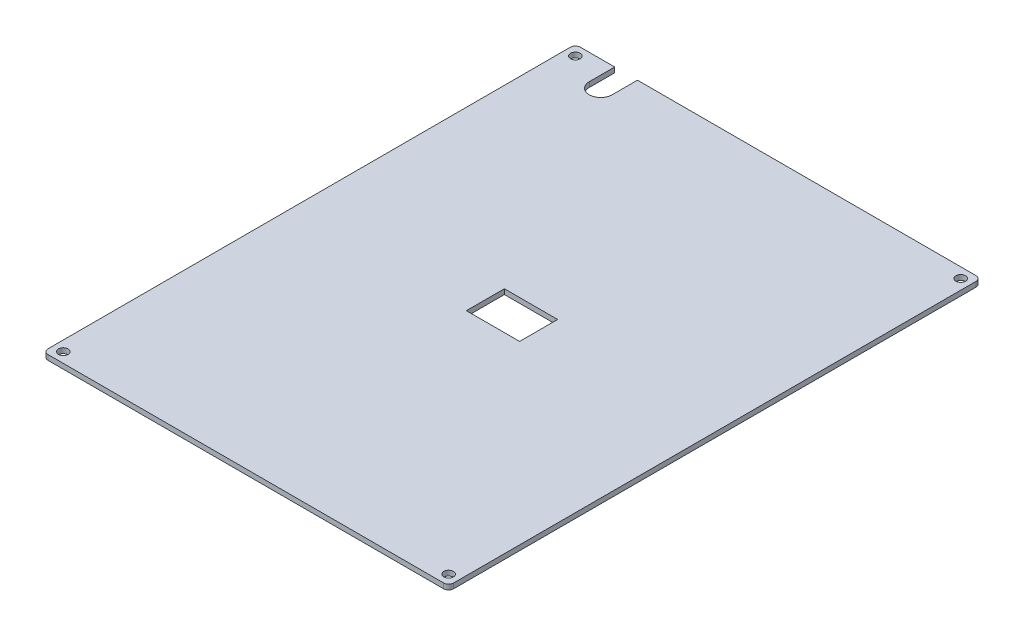
ISO-10303-21;
HEADER;
FILE_DESCRIPTION(('STEP AP214'),'2;1');
FILE_NAME('part.step','',(''),(''),'','','');
FILE_SCHEMA(('AUTOMOTIVE_DESIGN { 1 0 10303 214 1 1 1 1 }'));
ENDSEC;
DATA;
#1=APPLICATION_CONTEXT('core data for automotive mechanical design processes');
#2=APPLICATION_PROTOCOL_DEFINITION('international standard','automotive_design',2000,#1);
#3=PRODUCT_CONTEXT('',#1,'mechanical');
#4=PRODUCT('Part','Part','',(#3));
#5=PRODUCT_RELATED_PRODUCT_CATEGORY('part','',(#4));
#6=PRODUCT_DEFINITION_FORMATION('','',#4);
#7=PRODUCT_DEFINITION_CONTEXT('part definition',#1,'design');
#8=PRODUCT_DEFINITION('design','',#6,#7);
#9=PRODUCT_DEFINITION_SHAPE('','',#8);
#10=(LENGTH_UNIT() NAMED_UNIT(*) SI_UNIT(.MILLI.,.METRE.));
#11=(NAMED_UNIT(*) PLANE_ANGLE_UNIT() SI_UNIT($,.RADIAN.));
#12=(NAMED_UNIT(*) SI_UNIT($,.STERADIAN.) SOLID_ANGLE_UNIT());
#13=UNCERTAINTY_MEASURE_WITH_UNIT(LENGTH_MEASURE(1.E-05),#10,'distance_accuracy_value','');
#14=(GEOMETRIC_REPRESENTATION_CONTEXT(3) GLOBAL_UNCERTAINTY_ASSIGNED_CONTEXT((#13)) GLOBAL_UNIT_ASSIGNED_CONTEXT((#10,
#11,#12)) REPRESENTATION_CONTEXT('',''));
#15=CARTESIAN_POINT('',(0.,0.,0.));
#16=DIRECTION('',(0.,0.,1.));
#17=DIRECTION('',(1.,0.,0.));
#18=AXIS2_PLACEMENT_3D('',#15,#16,#17);
#19=CARTESIAN_POINT('',(0.,2.,-210.));
#20=DIRECTION('',(0.,0.,1.));
#21=DIRECTION('',(1.,0.,0.));
#22=AXIS2_PLACEMENT_3D('',#19,#20,#21);
#23=PLANE('',#22);
#24=DIRECTION('',(-1.,0.,0.));
#25=VECTOR('',#24,1.);
#26=CARTESIAN_POINT('',(0.,0.,-210.));
#27=LINE('',#26,#25);
#28=CARTESIAN_POINT('',(15.5,0.,-210.));
#29=VERTEX_POINT('',#28);
#30=CARTESIAN_POINT('',(2.,0.,-210.));
#31=VERTEX_POINT('',#30);
#32=EDGE_CURVE('E228',#29,#31,#27,.T.);
#33=ORIENTED_EDGE('',*,*,#32,.T.);
#34=DIRECTION('',(0.,-1.,0.));
#35=VECTOR('',#34,1.);
#36=CARTESIAN_POINT('',(2.,2.,-210.));
#37=LINE('',#36,#35);
#38=CARTESIAN_POINT('',(2.,2.,-210.));
#39=VERTEX_POINT('',#38);
#40=EDGE_CURVE('E279',#31,#39,#37,.F.);
#41=ORIENTED_EDGE('',*,*,#40,.T.);
#42=DIRECTION('',(-1.,0.,0.));
#43=VECTOR('',#42,1.);
#44=CARTESIAN_POINT('',(0.,2.,-210.));
#45=LINE('',#44,#43);
#46=CARTESIAN_POINT('',(15.5,2.,-210.));
#47=VERTEX_POINT('',#46);
#48=EDGE_CURVE('E214',#47,#39,#45,.T.);
#49=ORIENTED_EDGE('',*,*,#48,.F.);
#50=DIRECTION('',(0.,1.,0.));
#51=VECTOR('',#50,1.);
#52=CARTESIAN_POINT('',(15.5,-8.,-210.));
#53=LINE('',#52,#51);
#54=EDGE_CURVE('E195',#29,#47,#53,.T.);
#55=ORIENTED_EDGE('',*,*,#54,.F.);
#56=EDGE_LOOP('',(#33,#41,#49,#55));
#57=FACE_BOUND('',#56,.T.);
#58=ADVANCED_FACE('F33',(#57),#23,.F.);
#59=CARTESIAN_POINT('',(0.,2.,0.));
#60=DIRECTION('',(1.,0.,0.));
#61=DIRECTION('',(0.,0.,-1.));
#62=AXIS2_PLACEMENT_3D('',#59,#60,#61);
#63=PLANE('',#62);
#64=DIRECTION('',(0.,0.,1.));
#65=VECTOR('',#64,1.);
#66=CARTESIAN_POINT('',(0.,0.,0.));
#67=LINE('',#66,#65);
#68=CARTESIAN_POINT('',(0.,0.,-208.));
#69=VERTEX_POINT('',#68);
#70=CARTESIAN_POINT('',(0.,0.,-2.));
#71=VERTEX_POINT('',#70);
#72=EDGE_CURVE('E218',#69,#71,#67,.T.);
#73=ORIENTED_EDGE('',*,*,#72,.T.);
#74=DIRECTION('',(0.,-1.,0.));
#75=VECTOR('',#74,1.);
#76=CARTESIAN_POINT('',(0.,2.,-2.));
#77=LINE('',#76,#75);
#78=CARTESIAN_POINT('',(0.,2.,-2.));
#79=VERTEX_POINT('',#78);
#80=EDGE_CURVE('E261',#71,#79,#77,.F.);
#81=ORIENTED_EDGE('',*,*,#80,.T.);
#82=DIRECTION('',(0.,0.,1.));
#83=VECTOR('',#82,1.);
#84=CARTESIAN_POINT('',(0.,2.,0.));
#85=LINE('',#84,#83);
#86=CARTESIAN_POINT('',(0.,2.,-208.));
#87=VERTEX_POINT('',#86);
#88=EDGE_CURVE('E204',#87,#79,#85,.T.);
#89=ORIENTED_EDGE('',*,*,#88,.F.);
#90=DIRECTION('',(0.,-1.,0.));
#91=VECTOR('',#90,1.);
#92=CARTESIAN_POINT('',(0.,2.,-208.));
#93=LINE('',#92,#91);
#94=EDGE_CURVE('E258',#87,#69,#93,.T.);
#95=ORIENTED_EDGE('',*,*,#94,.T.);
#96=EDGE_LOOP('',(#73,#81,#89,#95));
#97=FACE_BOUND('',#96,.T.);
#98=ADVANCED_FACE('F304',(#97),#63,.F.);
#99=CARTESIAN_POINT('',(0.,2.,0.));
#100=DIRECTION('',(0.,0.,-1.));
#101=DIRECTION('',(-1.,0.,0.));
#102=AXIS2_PLACEMENT_3D('',#99,#100,#101);
#103=PLANE('',#102);
#104=DIRECTION('',(1.,0.,0.));
#105=VECTOR('',#104,1.);
#106=CARTESIAN_POINT('',(0.,2.,0.));
#107=LINE('',#106,#105);
#108=CARTESIAN_POINT('',(2.,2.,0.));
#109=VERTEX_POINT('',#108);
#110=CARTESIAN_POINT('',(158.,2.,0.));
#111=VERTEX_POINT('',#110);
#112=EDGE_CURVE('E207',#109,#111,#107,.T.);
#113=ORIENTED_EDGE('',*,*,#112,.F.);
#114=DIRECTION('',(0.,-1.,0.));
#115=VECTOR('',#114,1.);
#116=CARTESIAN_POINT('',(2.,2.,0.));
#117=LINE('',#116,#115);
#118=CARTESIAN_POINT('',(2.,0.,0.));
#119=VERTEX_POINT('',#118);
#120=EDGE_CURVE('E247',#109,#119,#117,.T.);
#121=ORIENTED_EDGE('',*,*,#120,.T.);
#122=DIRECTION('',(1.,0.,0.));
#123=VECTOR('',#122,1.);
#124=CARTESIAN_POINT('',(0.,0.,0.));
#125=LINE('',#124,#123);
#126=CARTESIAN_POINT('',(158.,0.,0.));
#127=VERTEX_POINT('',#126);
#128=EDGE_CURVE('E221',#119,#127,#125,.T.);
#129=ORIENTED_EDGE('',*,*,#128,.T.);
#130=DIRECTION('',(0.,-1.,0.));
#131=VECTOR('',#130,1.);
#132=CARTESIAN_POINT('',(158.,2.,0.));
#133=LINE('',#132,#131);
#134=EDGE_CURVE('E245',#127,#111,#133,.F.);
#135=ORIENTED_EDGE('',*,*,#134,.T.);
#136=EDGE_LOOP('',(#113,#121,#129,#135));
#137=FACE_BOUND('',#136,.T.);
#138=ADVANCED_FACE('F311',(#137),#103,.F.);
#139=CARTESIAN_POINT('',(160.,2.,0.));
#140=DIRECTION('',(-1.,0.,0.));
#141=DIRECTION('',(0.,0.,1.));
#142=AXIS2_PLACEMENT_3D('',#139,#140,#141);
#143=PLANE('',#142);
#144=DIRECTION('',(0.,0.,-1.));
#145=VECTOR('',#144,1.);
#146=CARTESIAN_POINT('',(160.,2.,0.));
#147=LINE('',#146,#145);
#148=CARTESIAN_POINT('',(160.,2.,-2.));
#149=VERTEX_POINT('',#148);
#150=CARTESIAN_POINT('',(160.,2.,-208.));
#151=VERTEX_POINT('',#150);
#152=EDGE_CURVE('E211',#149,#151,#147,.T.);
#153=ORIENTED_EDGE('',*,*,#152,.F.);
#154=DIRECTION('',(0.,-1.,0.));
#155=VECTOR('',#154,1.);
#156=CARTESIAN_POINT('',(160.,2.,-2.));
#157=LINE('',#156,#155);
#158=CARTESIAN_POINT('',(160.,0.,-2.));
#159=VERTEX_POINT('',#158);
#160=EDGE_CURVE('E273',#149,#159,#157,.T.);
#161=ORIENTED_EDGE('',*,*,#160,.T.);
#162=DIRECTION('',(0.,0.,-1.));
#163=VECTOR('',#162,1.);
#164=CARTESIAN_POINT('',(160.,0.,0.));
#165=LINE('',#164,#163);
#166=CARTESIAN_POINT('',(160.,0.,-208.));
#167=VERTEX_POINT('',#166);
#168=EDGE_CURVE('E225',#159,#167,#165,.T.);
#169=ORIENTED_EDGE('',*,*,#168,.T.);
#170=DIRECTION('',(0.,-1.,0.));
#171=VECTOR('',#170,1.);
#172=CARTESIAN_POINT('',(160.,2.,-208.));
#173=LINE('',#172,#171);
#174=EDGE_CURVE('E271',#167,#151,#173,.F.);
#175=ORIENTED_EDGE('',*,*,#174,.T.);
#176=EDGE_LOOP('',(#153,#161,#169,#175));
#177=FACE_BOUND('',#176,.T.);
#178=ADVANCED_FACE('F318',(#177),#143,.F.);
#179=CARTESIAN_POINT('',(158.,2.,-210.));
#180=VERTEX_POINT('',#179);
#181=CARTESIAN_POINT('',(24.5,2.,-210.));
#182=VERTEX_POINT('',#181);
#183=EDGE_CURVE('E215',#180,#182,#45,.T.);
#184=ORIENTED_EDGE('',*,*,#183,.F.);
#185=DIRECTION('',(0.,-1.,0.));
#186=VECTOR('',#185,1.);
#187=CARTESIAN_POINT('',(158.,2.,-210.));
#188=LINE('',#187,#186);
#189=CARTESIAN_POINT('',(158.,0.,-210.));
#190=VERTEX_POINT('',#189);
#191=EDGE_CURVE('E276',#180,#190,#188,.T.);
#192=ORIENTED_EDGE('',*,*,#191,.T.);
#193=CARTESIAN_POINT('',(24.5,0.,-210.));
#194=VERTEX_POINT('',#193);
#195=EDGE_CURVE('E208',#190,#194,#27,.T.);
#196=ORIENTED_EDGE('',*,*,#195,.T.);
#197=DIRECTION('',(0.,1.,0.));
#198=VECTOR('',#197,1.);
#199=CARTESIAN_POINT('',(24.5,-8.,-210.));
#200=LINE('',#199,#198);
#201=EDGE_CURVE('E197',#194,#182,#200,.T.);
#202=ORIENTED_EDGE('',*,*,#201,.T.);
#203=EDGE_LOOP('',(#184,#192,#196,#202));
#204=FACE_BOUND('',#203,.T.);
#205=ADVANCED_FACE('F307',(#204),#23,.F.);
#206=CARTESIAN_POINT('',(0.,2.,0.));
#207=DIRECTION('',(0.,-1.,0.));
#208=DIRECTION('',(0.,0.,-1.));
#209=AXIS2_PLACEMENT_3D('',#206,#207,#208);
#210=PLANE('',#209);
#211=DIRECTION('',(-1.,0.,0.));
#212=VECTOR('',#211,1.);
#213=CARTESIAN_POINT('',(69.5,2.,-112.5));
#214=LINE('',#213,#212);
#215=CARTESIAN_POINT('',(90.5,2.,-112.5));
#216=VERTEX_POINT('',#215);
#217=CARTESIAN_POINT('',(69.5,2.,-112.5));
#218=VERTEX_POINT('',#217);
#219=EDGE_CURVE('E157',#216,#218,#214,.T.);
#220=ORIENTED_EDGE('',*,*,#219,.F.);
#221=DIRECTION('',(0.,0.,-1.));
#222=VECTOR('',#221,1.);
#223=CARTESIAN_POINT('',(90.5,2.,-97.5));
#224=LINE('',#223,#222);
#225=CARTESIAN_POINT('',(90.5,2.,-97.5));
#226=VERTEX_POINT('',#225);
#227=EDGE_CURVE('E48',#226,#216,#224,.T.);
#228=ORIENTED_EDGE('',*,*,#227,.F.);
#229=DIRECTION('',(1.,0.,0.));
#230=VECTOR('',#229,1.);
#231=CARTESIAN_POINT('',(69.5,2.,-97.5));
#232=LINE('',#231,#230);
#233=CARTESIAN_POINT('',(69.5,2.,-97.5));
#234=VERTEX_POINT('',#233);
#235=EDGE_CURVE('E164',#234,#226,#232,.T.);
#236=ORIENTED_EDGE('',*,*,#235,.F.);
#237=DIRECTION('',(0.,0.,1.));
#238=VECTOR('',#237,1.);
#239=CARTESIAN_POINT('',(69.5,2.,-97.5));
#240=LINE('',#239,#238);
#241=EDGE_CURVE('E148',#218,#234,#240,.T.);
#242=ORIENTED_EDGE('',*,*,#241,.F.);
#243=EDGE_LOOP('',(#220,#228,#236,#242));
#244=FACE_BOUND('',#243,.T.);
#245=CARTESIAN_POINT('',(4.,2.,-4.00000000000003));
#246=DIRECTION('',(0.,1.,0.));
#247=DIRECTION('',(0.,0.,-1.));
#248=AXIS2_PLACEMENT_3D('',#245,#246,#247);
#249=CIRCLE('',#248,1.9);
#250=CARTESIAN_POINT('',(4.,2.,-5.90000000000003));
#251=VERTEX_POINT('',#250);
#252=EDGE_CURVE('E181',#251,#251,#249,.T.);
#253=ORIENTED_EDGE('',*,*,#252,.F.);
#254=EDGE_LOOP('',(#253));
#255=FACE_BOUND('',#254,.T.);
#256=CARTESIAN_POINT('',(156.,2.,-4.));
#257=DIRECTION('',(0.,1.,0.));
#258=DIRECTION('',(0.,0.,1.));
#259=AXIS2_PLACEMENT_3D('',#256,#257,#258);
#260=CIRCLE('',#259,1.9);
#261=CARTESIAN_POINT('',(156.,2.,-2.1));
#262=VERTEX_POINT('',#261);
#263=EDGE_CURVE('E178',#262,#262,#260,.T.);
#264=ORIENTED_EDGE('',*,*,#263,.F.);
#265=EDGE_LOOP('',(#264));
#266=FACE_BOUND('',#265,.T.);
#267=CARTESIAN_POINT('',(156.,2.,-206.));
#268=DIRECTION('',(0.,1.,0.));
#269=DIRECTION('',(0.,0.,-1.));
#270=AXIS2_PLACEMENT_3D('',#267,#268,#269);
#271=CIRCLE('',#270,1.90000000000001);
#272=CARTESIAN_POINT('',(156.,2.,-207.9));
#273=VERTEX_POINT('',#272);
#274=EDGE_CURVE('E174',#273,#273,#271,.T.);
#275=ORIENTED_EDGE('',*,*,#274,.F.);
#276=EDGE_LOOP('',(#275));
#277=FACE_BOUND('',#276,.T.);
#278=CARTESIAN_POINT('',(4.,2.,-206.));
#279=DIRECTION('',(0.,1.,0.));
#280=DIRECTION('',(0.,0.,1.));
#281=AXIS2_PLACEMENT_3D('',#278,#279,#280);
#282=CIRCLE('',#281,1.90000000000001);
#283=CARTESIAN_POINT('',(4.,2.,-204.1));
#284=VERTEX_POINT('',#283);
#285=EDGE_CURVE('E177',#284,#284,#282,.T.);
#286=ORIENTED_EDGE('',*,*,#285,.F.);
#287=EDGE_LOOP('',(#286));
#288=FACE_BOUND('',#287,.T.);
#289=ORIENTED_EDGE('',*,*,#88,.T.);
#290=CARTESIAN_POINT('',(2.,2.,-2.));
#291=DIRECTION('',(0.,-1.,0.));
#292=DIRECTION('',(0.,0.,-1.));
#293=AXIS2_PLACEMENT_3D('',#290,#291,#292);
#294=CIRCLE('',#293,2.);
#295=EDGE_CURVE('E269',#79,#109,#294,.F.);
#296=ORIENTED_EDGE('',*,*,#295,.T.);
#297=ORIENTED_EDGE('',*,*,#112,.T.);
#298=CARTESIAN_POINT('',(158.,2.,-2.));
#299=DIRECTION('',(0.,-1.,0.));
#300=DIRECTION('',(0.,0.,-1.));
#301=AXIS2_PLACEMENT_3D('',#298,#299,#300);
#302=CIRCLE('',#301,2.);
#303=EDGE_CURVE('E267',#111,#149,#302,.F.);
#304=ORIENTED_EDGE('',*,*,#303,.T.);
#305=ORIENTED_EDGE('',*,*,#152,.T.);
#306=CARTESIAN_POINT('',(158.,2.,-208.));
#307=DIRECTION('',(0.,-1.,0.));
#308=DIRECTION('',(0.,0.,-1.));
#309=AXIS2_PLACEMENT_3D('',#306,#307,#308);
#310=CIRCLE('',#309,2.);
#311=EDGE_CURVE('E265',#151,#180,#310,.F.);
#312=ORIENTED_EDGE('',*,*,#311,.T.);
#313=ORIENTED_EDGE('',*,*,#183,.T.);
#314=DIRECTION('',(0.,0.,-1.));
#315=VECTOR('',#314,1.);
#316=CARTESIAN_POINT('',(24.5,2.,-200.));
#317=LINE('',#316,#315);
#318=CARTESIAN_POINT('',(24.5,2.,-200.));
#319=VERTEX_POINT('',#318);
#320=EDGE_CURVE('E187',#319,#182,#317,.T.);
#321=ORIENTED_EDGE('',*,*,#320,.F.);
#322=CARTESIAN_POINT('',(20.,2.,-200.));
#323=DIRECTION('',(0.,1.,0.));
#324=DIRECTION('',(0.,0.,1.));
#325=AXIS2_PLACEMENT_3D('',#322,#323,#324);
#326=CIRCLE('',#325,4.5);
#327=CARTESIAN_POINT('',(15.5,2.,-200.));
#328=VERTEX_POINT('',#327);
#329=EDGE_CURVE('E171',#328,#319,#326,.T.);
#330=ORIENTED_EDGE('',*,*,#329,.F.);
#331=DIRECTION('',(0.,0.,1.));
#332=VECTOR('',#331,1.);
#333=CARTESIAN_POINT('',(15.5,2.,-200.));
#334=LINE('',#333,#332);
#335=EDGE_CURVE('E190',#47,#328,#334,.T.);
#336=ORIENTED_EDGE('',*,*,#335,.F.);
#337=ORIENTED_EDGE('',*,*,#48,.T.);
#338=CARTESIAN_POINT('',(2.,2.,-208.));
#339=DIRECTION('',(0.,-1.,0.));
#340=DIRECTION('',(0.,0.,-1.));
#341=AXIS2_PLACEMENT_3D('',#338,#339,#340);
#342=CIRCLE('',#341,2.);
#343=EDGE_CURVE('E263',#39,#87,#342,.F.);
#344=ORIENTED_EDGE('',*,*,#343,.T.);
#345=EDGE_LOOP('',(#289,#296,#297,#304,#305,#312,#313,#321,#330,#336,#337,#344));
#346=FACE_BOUND('',#345,.T.);
#347=ADVANCED_FACE('F161',(#244,#255,#266,#277,#288,#346),#210,.F.);
#348=CARTESIAN_POINT('',(0.,0.,0.));
#349=DIRECTION('',(0.,-1.,0.));
#350=DIRECTION('',(0.,0.,-1.));
#351=AXIS2_PLACEMENT_3D('',#348,#349,#350);
#352=PLANE('',#351);
#353=DIRECTION('',(0.,0.,1.));
#354=VECTOR('',#353,1.);
#355=CARTESIAN_POINT('',(90.5,0.,0.));
#356=LINE('',#355,#354);
#357=CARTESIAN_POINT('',(90.5,0.,-112.5));
#358=VERTEX_POINT('',#357);
#359=CARTESIAN_POINT('',(90.5,0.,-97.5));
#360=VERTEX_POINT('',#359);
#361=EDGE_CURVE('E11',#358,#360,#356,.T.);
#362=ORIENTED_EDGE('',*,*,#361,.F.);
#363=DIRECTION('',(1.,0.,0.));
#364=VECTOR('',#363,1.);
#365=CARTESIAN_POINT('',(0.,0.,-112.5));
#366=LINE('',#365,#364);
#367=CARTESIAN_POINT('',(69.5,0.,-112.5));
#368=VERTEX_POINT('',#367);
#369=EDGE_CURVE('E281',#368,#358,#366,.T.);
#370=ORIENTED_EDGE('',*,*,#369,.F.);
#371=DIRECTION('',(0.,0.,-1.));
#372=VECTOR('',#371,1.);
#373=CARTESIAN_POINT('',(69.5,0.,0.));
#374=LINE('',#373,#372);
#375=CARTESIAN_POINT('',(69.5,0.,-97.5));
#376=VERTEX_POINT('',#375);
#377=EDGE_CURVE('E151',#376,#368,#374,.T.);
#378=ORIENTED_EDGE('',*,*,#377,.F.);
#379=DIRECTION('',(-1.,0.,0.));
#380=VECTOR('',#379,1.);
#381=CARTESIAN_POINT('',(0.,0.,-97.5));
#382=LINE('',#381,#380);
#383=EDGE_CURVE('E41',#360,#376,#382,.T.);
#384=ORIENTED_EDGE('',*,*,#383,.F.);
#385=EDGE_LOOP('',(#362,#370,#378,#384));
#386=FACE_BOUND('',#385,.T.);
#387=ORIENTED_EDGE('',*,*,#128,.F.);
#388=CARTESIAN_POINT('',(2.,0.,-2.));
#389=DIRECTION('',(0.,-1.,0.));
#390=DIRECTION('',(0.,0.,-1.));
#391=AXIS2_PLACEMENT_3D('',#388,#389,#390);
#392=CIRCLE('',#391,2.);
#393=EDGE_CURVE('E256',#119,#71,#392,.T.);
#394=ORIENTED_EDGE('',*,*,#393,.T.);
#395=ORIENTED_EDGE('',*,*,#72,.F.);
#396=CARTESIAN_POINT('',(2.,0.,-208.));
#397=DIRECTION('',(0.,-1.,0.));
#398=DIRECTION('',(0.,0.,-1.));
#399=AXIS2_PLACEMENT_3D('',#396,#397,#398);
#400=CIRCLE('',#399,2.);
#401=EDGE_CURVE('E250',#69,#31,#400,.T.);
#402=ORIENTED_EDGE('',*,*,#401,.T.);
#403=ORIENTED_EDGE('',*,*,#32,.F.);
#404=DIRECTION('',(0.,0.,-1.));
#405=VECTOR('',#404,1.);
#406=CARTESIAN_POINT('',(15.5000000000002,0.,0.));
#407=LINE('',#406,#405);
#408=CARTESIAN_POINT('',(15.5,0.,-200.));
#409=VERTEX_POINT('',#408);
#410=EDGE_CURVE('E243',#409,#29,#407,.T.);
#411=ORIENTED_EDGE('',*,*,#410,.F.);
#412=CARTESIAN_POINT('',(20.,0.,-200.));
#413=DIRECTION('',(0.,-1.,0.));
#414=DIRECTION('',(0.,0.,-1.));
#415=AXIS2_PLACEMENT_3D('',#412,#413,#414);
#416=CIRCLE('',#415,4.5);
#417=CARTESIAN_POINT('',(24.5,0.,-200.));
#418=VERTEX_POINT('',#417);
#419=EDGE_CURVE('E241',#418,#409,#416,.T.);
#420=ORIENTED_EDGE('',*,*,#419,.F.);
#421=DIRECTION('',(0.,0.,1.));
#422=VECTOR('',#421,1.);
#423=CARTESIAN_POINT('',(24.5000000000001,0.,0.));
#424=LINE('',#423,#422);
#425=EDGE_CURVE('E217',#194,#418,#424,.T.);
#426=ORIENTED_EDGE('',*,*,#425,.F.);
#427=ORIENTED_EDGE('',*,*,#195,.F.);
#428=CARTESIAN_POINT('',(158.,0.,-208.));
#429=DIRECTION('',(0.,-1.,0.));
#430=DIRECTION('',(0.,0.,-1.));
#431=AXIS2_PLACEMENT_3D('',#428,#429,#430);
#432=CIRCLE('',#431,2.);
#433=EDGE_CURVE('E252',#190,#167,#432,.T.);
#434=ORIENTED_EDGE('',*,*,#433,.T.);
#435=ORIENTED_EDGE('',*,*,#168,.F.);
#436=CARTESIAN_POINT('',(158.,0.,-2.));
#437=DIRECTION('',(0.,-1.,0.));
#438=DIRECTION('',(0.,0.,-1.));
#439=AXIS2_PLACEMENT_3D('',#436,#437,#438);
#440=CIRCLE('',#439,2.);
#441=EDGE_CURVE('E254',#159,#127,#440,.T.);
#442=ORIENTED_EDGE('',*,*,#441,.T.);
#443=EDGE_LOOP('',(#387,#394,#395,#402,#403,#411,#420,#426,#427,#434,#435,#442));
#444=FACE_BOUND('',#443,.T.);
#445=CARTESIAN_POINT('',(4.,0.,-4.00000000000003));
#446=DIRECTION('',(0.,-1.,0.));
#447=DIRECTION('',(0.,0.,-1.));
#448=AXIS2_PLACEMENT_3D('',#445,#446,#447);
#449=CIRCLE('',#448,1.9);
#450=CARTESIAN_POINT('',(4.,0.,-5.90000000000003));
#451=VERTEX_POINT('',#450);
#452=EDGE_CURVE('E222',#451,#451,#449,.T.);
#453=ORIENTED_EDGE('',*,*,#452,.F.);
#454=EDGE_LOOP('',(#453));
#455=FACE_BOUND('',#454,.T.);
#456=CARTESIAN_POINT('',(156.,0.,-4.));
#457=DIRECTION('',(0.,-1.,0.));
#458=DIRECTION('',(0.,0.,-1.));
#459=AXIS2_PLACEMENT_3D('',#456,#457,#458);
#460=CIRCLE('',#459,1.9);
#461=CARTESIAN_POINT('',(156.,0.,-5.90000000000001));
#462=VERTEX_POINT('',#461);
#463=EDGE_CURVE('E235',#462,#462,#460,.T.);
#464=ORIENTED_EDGE('',*,*,#463,.F.);
#465=EDGE_LOOP('',(#464));
#466=FACE_BOUND('',#465,.T.);
#467=CARTESIAN_POINT('',(156.,0.,-206.));
#468=DIRECTION('',(0.,-1.,0.));
#469=DIRECTION('',(0.,0.,-1.));
#470=AXIS2_PLACEMENT_3D('',#467,#468,#469);
#471=CIRCLE('',#470,1.90000000000001);
#472=CARTESIAN_POINT('',(156.,0.,-207.9));
#473=VERTEX_POINT('',#472);
#474=EDGE_CURVE('E232',#473,#473,#471,.T.);
#475=ORIENTED_EDGE('',*,*,#474,.F.);
#476=EDGE_LOOP('',(#475));
#477=FACE_BOUND('',#476,.T.);
#478=CARTESIAN_POINT('',(4.,0.,-206.));
#479=DIRECTION('',(0.,-1.,0.));
#480=DIRECTION('',(0.,0.,-1.));
#481=AXIS2_PLACEMENT_3D('',#478,#479,#480);
#482=CIRCLE('',#481,1.90000000000001);
#483=CARTESIAN_POINT('',(4.,0.,-207.9));
#484=VERTEX_POINT('',#483);
#485=EDGE_CURVE('E203',#484,#484,#482,.T.);
#486=ORIENTED_EDGE('',*,*,#485,.F.);
#487=EDGE_LOOP('',(#486));
#488=FACE_BOUND('',#487,.T.);
#489=ADVANCED_FACE('F289',(#386,#444,#455,#466,#477,#488),#352,.T.);
#490=CARTESIAN_POINT('',(4.,-8.,-206.));
#491=DIRECTION('',(0.,1.,0.));
#492=DIRECTION('',(0.,0.,1.));
#493=AXIS2_PLACEMENT_3D('',#490,#491,#492);
#494=CYLINDRICAL_SURFACE('',#493,1.90000000000001);
#495=ORIENTED_EDGE('',*,*,#485,.T.);
#496=EDGE_LOOP('',(#495));
#497=FACE_BOUND('',#496,.T.);
#498=ORIENTED_EDGE('',*,*,#285,.T.);
#499=EDGE_LOOP('',(#498));
#500=FACE_BOUND('',#499,.T.);
#501=ADVANCED_FACE('F386',(#497,#500),#494,.F.);
#502=CARTESIAN_POINT('',(156.,-8.,-206.));
#503=DIRECTION('',(0.,1.,0.));
#504=DIRECTION('',(0.,0.,1.));
#505=AXIS2_PLACEMENT_3D('',#502,#503,#504);
#506=CYLINDRICAL_SURFACE('',#505,1.90000000000001);
#507=ORIENTED_EDGE('',*,*,#474,.T.);
#508=EDGE_LOOP('',(#507));
#509=FACE_BOUND('',#508,.T.);
#510=ORIENTED_EDGE('',*,*,#274,.T.);
#511=EDGE_LOOP('',(#510));
#512=FACE_BOUND('',#511,.T.);
#513=ADVANCED_FACE('F388',(#509,#512),#506,.F.);
#514=CARTESIAN_POINT('',(156.,-8.,-4.));
#515=DIRECTION('',(0.,1.,0.));
#516=DIRECTION('',(0.,0.,1.));
#517=AXIS2_PLACEMENT_3D('',#514,#515,#516);
#518=CYLINDRICAL_SURFACE('',#517,1.9);
#519=ORIENTED_EDGE('',*,*,#463,.T.);
#520=EDGE_LOOP('',(#519));
#521=FACE_BOUND('',#520,.T.);
#522=ORIENTED_EDGE('',*,*,#263,.T.);
#523=EDGE_LOOP('',(#522));
#524=FACE_BOUND('',#523,.T.);
#525=ADVANCED_FACE('F405',(#521,#524),#518,.F.);
#526=CARTESIAN_POINT('',(4.,-8.,-4.00000000000003));
#527=DIRECTION('',(0.,1.,0.));
#528=DIRECTION('',(0.,0.,1.));
#529=AXIS2_PLACEMENT_3D('',#526,#527,#528);
#530=CYLINDRICAL_SURFACE('',#529,1.9);
#531=ORIENTED_EDGE('',*,*,#452,.T.);
#532=EDGE_LOOP('',(#531));
#533=FACE_BOUND('',#532,.T.);
#534=ORIENTED_EDGE('',*,*,#252,.T.);
#535=EDGE_LOOP('',(#534));
#536=FACE_BOUND('',#535,.T.);
#537=ADVANCED_FACE('F385',(#533,#536),#530,.F.);
#538=CARTESIAN_POINT('',(20.,-8.,-200.));
#539=DIRECTION('',(0.,1.,0.));
#540=DIRECTION('',(0.,0.,1.));
#541=AXIS2_PLACEMENT_3D('',#538,#539,#540);
#542=CYLINDRICAL_SURFACE('',#541,4.5);
#543=ORIENTED_EDGE('',*,*,#419,.T.);
#544=DIRECTION('',(0.,1.,0.));
#545=VECTOR('',#544,1.);
#546=CARTESIAN_POINT('',(15.5,-8.,-200.));
#547=LINE('',#546,#545);
#548=EDGE_CURVE('E184',#409,#328,#547,.T.);
#549=ORIENTED_EDGE('',*,*,#548,.T.);
#550=ORIENTED_EDGE('',*,*,#329,.T.);
#551=DIRECTION('',(0.,1.,0.));
#552=VECTOR('',#551,1.);
#553=CARTESIAN_POINT('',(24.5,-8.,-200.));
#554=LINE('',#553,#552);
#555=EDGE_CURVE('E193',#418,#319,#554,.T.);
#556=ORIENTED_EDGE('',*,*,#555,.F.);
#557=EDGE_LOOP('',(#543,#549,#550,#556));
#558=FACE_BOUND('',#557,.T.);
#559=ADVANCED_FACE('F369',(#558),#542,.F.);
#560=CARTESIAN_POINT('',(15.5,-8.,-200.));
#561=DIRECTION('',(-1.,0.,0.));
#562=DIRECTION('',(0.,0.,1.));
#563=AXIS2_PLACEMENT_3D('',#560,#561,#562);
#564=PLANE('',#563);
#565=ORIENTED_EDGE('',*,*,#410,.T.);
#566=ORIENTED_EDGE('',*,*,#54,.T.);
#567=ORIENTED_EDGE('',*,*,#335,.T.);
#568=ORIENTED_EDGE('',*,*,#548,.F.);
#569=EDGE_LOOP('',(#565,#566,#567,#568));
#570=FACE_BOUND('',#569,.T.);
#571=ADVANCED_FACE('F364',(#570),#564,.F.);
#572=CARTESIAN_POINT('',(24.5,-8.,-200.));
#573=DIRECTION('',(1.,0.,0.));
#574=DIRECTION('',(0.,0.,-1.));
#575=AXIS2_PLACEMENT_3D('',#572,#573,#574);
#576=PLANE('',#575);
#577=ORIENTED_EDGE('',*,*,#425,.T.);
#578=ORIENTED_EDGE('',*,*,#555,.T.);
#579=ORIENTED_EDGE('',*,*,#320,.T.);
#580=ORIENTED_EDGE('',*,*,#201,.F.);
#581=EDGE_LOOP('',(#577,#578,#579,#580));
#582=FACE_BOUND('',#581,.T.);
#583=ADVANCED_FACE('F372',(#582),#576,.F.);
#584=CARTESIAN_POINT('',(2.,2.,-2.));
#585=DIRECTION('',(0.,-1.,0.));
#586=DIRECTION('',(0.,0.,-1.));
#587=AXIS2_PLACEMENT_3D('',#584,#585,#586);
#588=CYLINDRICAL_SURFACE('',#587,2.);
#589=ORIENTED_EDGE('',*,*,#295,.F.);
#590=ORIENTED_EDGE('',*,*,#80,.F.);
#591=ORIENTED_EDGE('',*,*,#393,.F.);
#592=ORIENTED_EDGE('',*,*,#120,.F.);
#593=EDGE_LOOP('',(#589,#590,#591,#592));
#594=FACE_BOUND('',#593,.T.);
#595=ADVANCED_FACE('F350',(#594),#588,.T.);
#596=CARTESIAN_POINT('',(158.,2.,-2.));
#597=DIRECTION('',(0.,-1.,0.));
#598=DIRECTION('',(0.,0.,-1.));
#599=AXIS2_PLACEMENT_3D('',#596,#597,#598);
#600=CYLINDRICAL_SURFACE('',#599,2.);
#601=ORIENTED_EDGE('',*,*,#303,.F.);
#602=ORIENTED_EDGE('',*,*,#134,.F.);
#603=ORIENTED_EDGE('',*,*,#441,.F.);
#604=ORIENTED_EDGE('',*,*,#160,.F.);
#605=EDGE_LOOP('',(#601,#602,#603,#604));
#606=FACE_BOUND('',#605,.T.);
#607=ADVANCED_FACE('F343',(#606),#600,.T.);
#608=CARTESIAN_POINT('',(158.,2.,-208.));
#609=DIRECTION('',(0.,-1.,0.));
#610=DIRECTION('',(0.,0.,-1.));
#611=AXIS2_PLACEMENT_3D('',#608,#609,#610);
#612=CYLINDRICAL_SURFACE('',#611,2.);
#613=ORIENTED_EDGE('',*,*,#311,.F.);
#614=ORIENTED_EDGE('',*,*,#174,.F.);
#615=ORIENTED_EDGE('',*,*,#433,.F.);
#616=ORIENTED_EDGE('',*,*,#191,.F.);
#617=EDGE_LOOP('',(#613,#614,#615,#616));
#618=FACE_BOUND('',#617,.T.);
#619=ADVANCED_FACE('F299',(#618),#612,.T.);
#620=CARTESIAN_POINT('',(2.,2.,-208.));
#621=DIRECTION('',(0.,-1.,0.));
#622=DIRECTION('',(0.,0.,-1.));
#623=AXIS2_PLACEMENT_3D('',#620,#621,#622);
#624=CYLINDRICAL_SURFACE('',#623,2.);
#625=ORIENTED_EDGE('',*,*,#343,.F.);
#626=ORIENTED_EDGE('',*,*,#40,.F.);
#627=ORIENTED_EDGE('',*,*,#401,.F.);
#628=ORIENTED_EDGE('',*,*,#94,.F.);
#629=EDGE_LOOP('',(#625,#626,#627,#628));
#630=FACE_BOUND('',#629,.T.);
#631=ADVANCED_FACE('F35',(#630),#624,.T.);
#632=CARTESIAN_POINT('',(90.5,-8.,-97.5));
#633=DIRECTION('',(1.,0.,0.));
#634=DIRECTION('',(0.,0.,-1.));
#635=AXIS2_PLACEMENT_3D('',#632,#633,#634);
#636=PLANE('',#635);
#637=ORIENTED_EDGE('',*,*,#361,.T.);
#638=DIRECTION('',(0.,1.,0.));
#639=VECTOR('',#638,1.);
#640=CARTESIAN_POINT('',(90.5,-8.,-97.5));
#641=LINE('',#640,#639);
#642=EDGE_CURVE('E169',#360,#226,#641,.T.);
#643=ORIENTED_EDGE('',*,*,#642,.T.);
#644=ORIENTED_EDGE('',*,*,#227,.T.);
#645=DIRECTION('',(0.,1.,0.));
#646=VECTOR('',#645,1.);
#647=CARTESIAN_POINT('',(90.5,-8.,-112.5));
#648=LINE('',#647,#646);
#649=EDGE_CURVE('E154',#358,#216,#648,.T.);
#650=ORIENTED_EDGE('',*,*,#649,.F.);
#651=EDGE_LOOP('',(#637,#643,#644,#650));
#652=FACE_BOUND('',#651,.T.);
#653=ADVANCED_FACE('F291',(#652),#636,.F.);
#654=CARTESIAN_POINT('',(69.5,-8.,-97.5));
#655=DIRECTION('',(0.,0.,1.));
#656=DIRECTION('',(1.,0.,0.));
#657=AXIS2_PLACEMENT_3D('',#654,#655,#656);
#658=PLANE('',#657);
#659=ORIENTED_EDGE('',*,*,#383,.T.);
#660=DIRECTION('',(0.,1.,0.));
#661=VECTOR('',#660,1.);
#662=CARTESIAN_POINT('',(69.5,-8.,-97.5));
#663=LINE('',#662,#661);
#664=EDGE_CURVE('E153',#376,#234,#663,.T.);
#665=ORIENTED_EDGE('',*,*,#664,.T.);
#666=ORIENTED_EDGE('',*,*,#235,.T.);
#667=ORIENTED_EDGE('',*,*,#642,.F.);
#668=EDGE_LOOP('',(#659,#665,#666,#667));
#669=FACE_BOUND('',#668,.T.);
#670=ADVANCED_FACE('F286',(#669),#658,.F.);
#671=CARTESIAN_POINT('',(69.5,-8.,-97.5));
#672=DIRECTION('',(-1.,0.,0.));
#673=DIRECTION('',(0.,0.,1.));
#674=AXIS2_PLACEMENT_3D('',#671,#672,#673);
#675=PLANE('',#674);
#676=ORIENTED_EDGE('',*,*,#377,.T.);
#677=DIRECTION('',(0.,1.,0.));
#678=VECTOR('',#677,1.);
#679=CARTESIAN_POINT('',(69.5,-8.,-112.5));
#680=LINE('',#679,#678);
#681=EDGE_CURVE('E56',#368,#218,#680,.T.);
#682=ORIENTED_EDGE('',*,*,#681,.T.);
#683=ORIENTED_EDGE('',*,*,#241,.T.);
#684=ORIENTED_EDGE('',*,*,#664,.F.);
#685=EDGE_LOOP('',(#676,#682,#683,#684));
#686=FACE_BOUND('',#685,.T.);
#687=ADVANCED_FACE('F145',(#686),#675,.F.);
#688=CARTESIAN_POINT('',(69.5,-8.,-112.5));
#689=DIRECTION('',(0.,0.,-1.));
#690=DIRECTION('',(-1.,0.,0.));
#691=AXIS2_PLACEMENT_3D('',#688,#689,#690);
#692=PLANE('',#691);
#693=ORIENTED_EDGE('',*,*,#369,.T.);
#694=ORIENTED_EDGE('',*,*,#649,.T.);
#695=ORIENTED_EDGE('',*,*,#219,.T.);
#696=ORIENTED_EDGE('',*,*,#681,.F.);
#697=EDGE_LOOP('',(#693,#694,#695,#696));
#698=FACE_BOUND('',#697,.T.);
#699=ADVANCED_FACE('F158',(#698),#692,.F.);
#700=CLOSED_SHELL('',(#58,#98,#138,#178,#205,#347,#489,#501,#513,#525,#537,#559,#571,#583,#595,
#607,#619,#631,#653,#670,#687,#699));
#701=MANIFOLD_SOLID_BREP('B2',#700);
#702=ADVANCED_BREP_SHAPE_REPRESENTATION('',(#18,#701),#14);
#703=SHAPE_DEFINITION_REPRESENTATION(#9,#702);
ENDSEC;
END-ISO-10303-21;
